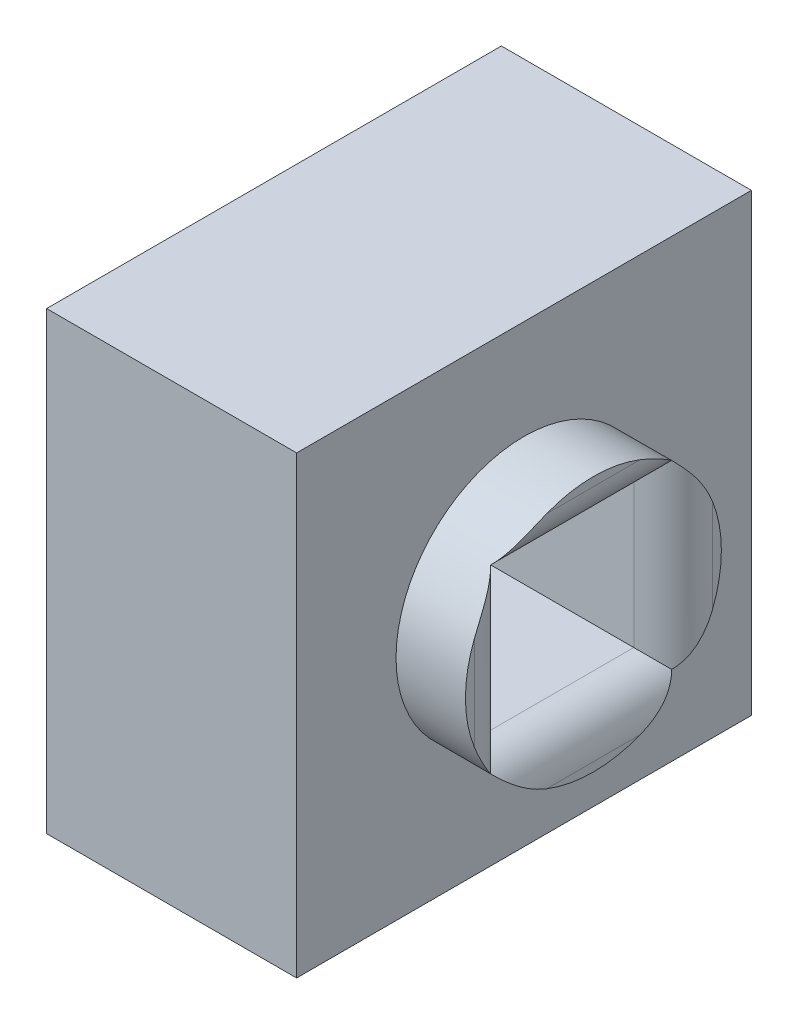
ISO-10303-21;
HEADER;
FILE_DESCRIPTION(('STEP AP214'),'2;1');
FILE_NAME('part.step','',(''),(''),'','','');
FILE_SCHEMA(('AUTOMOTIVE_DESIGN { 1 0 10303 214 1 1 1 1 }'));
ENDSEC;
DATA;
#1=APPLICATION_CONTEXT('core data for automotive mechanical design processes');
#2=APPLICATION_PROTOCOL_DEFINITION('international standard','automotive_design',2000,#1);
#3=PRODUCT_CONTEXT('',#1,'mechanical');
#4=PRODUCT('Part','Part','',(#3));
#5=PRODUCT_RELATED_PRODUCT_CATEGORY('part','',(#4));
#6=PRODUCT_DEFINITION_FORMATION('','',#4);
#7=PRODUCT_DEFINITION_CONTEXT('part definition',#1,'design');
#8=PRODUCT_DEFINITION('design','',#6,#7);
#9=PRODUCT_DEFINITION_SHAPE('','',#8);
#10=(LENGTH_UNIT() NAMED_UNIT(*) SI_UNIT(.MILLI.,.METRE.));
#11=(NAMED_UNIT(*) PLANE_ANGLE_UNIT() SI_UNIT($,.RADIAN.));
#12=(NAMED_UNIT(*) SI_UNIT($,.STERADIAN.) SOLID_ANGLE_UNIT());
#13=UNCERTAINTY_MEASURE_WITH_UNIT(LENGTH_MEASURE(1.E-05),#10,'distance_accuracy_value','');
#14=(GEOMETRIC_REPRESENTATION_CONTEXT(3) GLOBAL_UNCERTAINTY_ASSIGNED_CONTEXT((#13)) GLOBAL_UNIT_ASSIGNED_CONTEXT((#10,
#11,#12)) REPRESENTATION_CONTEXT('',''));
#15=CARTESIAN_POINT('',(0.,0.,0.));
#16=DIRECTION('',(0.,0.,1.));
#17=DIRECTION('',(1.,0.,0.));
#18=AXIS2_PLACEMENT_3D('',#15,#16,#17);
#19=CARTESIAN_POINT('',(16.225,4.05,-4.05));
#20=DIRECTION('',(1.,0.,0.));
#21=DIRECTION('',(0.,0.,-1.));
#22=AXIS2_PLACEMENT_3D('',#19,#20,#21);
#23=PLANE('',#22);
#24=CARTESIAN_POINT('',(16.225,4.05,-4.05));
#25=DIRECTION('',(1.,0.,0.));
#26=DIRECTION('',(0.,0.,-1.));
#27=AXIS2_PLACEMENT_3D('',#24,#25,#26);
#28=CIRCLE('',#27,6.5);
#29=CARTESIAN_POINT('',(16.225,6.42644692766322,2.));
#30=VERTEX_POINT('',#29);
#31=CARTESIAN_POINT('',(16.225,1.67355307233677,2.));
#32=VERTEX_POINT('',#31);
#33=EDGE_CURVE('E466',#30,#32,#28,.T.);
#34=ORIENTED_EDGE('',*,*,#33,.T.);
#35=DIRECTION('',(0.,-1.,0.));
#36=VECTOR('',#35,1.);
#37=CARTESIAN_POINT('',(16.225,4.05,2.));
#38=LINE('',#37,#36);
#39=EDGE_CURVE('E12',#32,#30,#38,.F.);
#40=ORIENTED_EDGE('',*,*,#39,.T.);
#41=EDGE_LOOP('',(#34,#40));
#42=FACE_BOUND('',#41,.T.);
#43=ADVANCED_FACE('F58',(#42),#23,.T.);
#44=CARTESIAN_POINT('',(16.225,-2.,-1.67355307233677));
#45=VERTEX_POINT('',#44);
#46=CARTESIAN_POINT('',(16.225,-2.,-6.42644692766322));
#47=VERTEX_POINT('',#46);
#48=EDGE_CURVE('E381',#45,#47,#28,.T.);
#49=ORIENTED_EDGE('',*,*,#48,.T.);
#50=DIRECTION('',(0.,0.,-1.));
#51=VECTOR('',#50,1.);
#52=CARTESIAN_POINT('',(16.225,-2.,-4.05));
#53=LINE('',#52,#51);
#54=EDGE_CURVE('E68',#47,#45,#53,.F.);
#55=ORIENTED_EDGE('',*,*,#54,.T.);
#56=EDGE_LOOP('',(#49,#55));
#57=FACE_BOUND('',#56,.T.);
#58=ADVANCED_FACE('F361',(#57),#23,.T.);
#59=CARTESIAN_POINT('',(16.225,1.67355307233677,-10.1));
#60=VERTEX_POINT('',#59);
#61=CARTESIAN_POINT('',(16.225,6.42644692766322,-10.1));
#62=VERTEX_POINT('',#61);
#63=EDGE_CURVE('E378',#60,#62,#28,.T.);
#64=ORIENTED_EDGE('',*,*,#63,.T.);
#65=DIRECTION('',(0.,1.,0.));
#66=VECTOR('',#65,1.);
#67=CARTESIAN_POINT('',(16.225,4.05,-10.1));
#68=LINE('',#67,#66);
#69=EDGE_CURVE('E380',#62,#60,#68,.F.);
#70=ORIENTED_EDGE('',*,*,#69,.T.);
#71=EDGE_LOOP('',(#64,#70));
#72=FACE_BOUND('',#71,.T.);
#73=ADVANCED_FACE('F345',(#72),#23,.T.);
#74=CARTESIAN_POINT('',(12.7,0.,0.));
#75=DIRECTION('',(1.,0.,0.));
#76=DIRECTION('',(0.,0.,-1.));
#77=AXIS2_PLACEMENT_3D('',#74,#75,#76);
#78=PLANE('',#77);
#79=DIRECTION('',(0.,-1.,0.));
#80=VECTOR('',#79,1.);
#81=CARTESIAN_POINT('',(12.7,0.,7.5));
#82=LINE('',#81,#80);
#83=CARTESIAN_POINT('',(12.7,15.6,7.5));
#84=VERTEX_POINT('',#83);
#85=CARTESIAN_POINT('',(12.7,-7.5,7.5));
#86=VERTEX_POINT('',#85);
#87=EDGE_CURVE('E186',#84,#86,#82,.T.);
#88=ORIENTED_EDGE('',*,*,#87,.T.);
#89=DIRECTION('',(0.,0.,-1.));
#90=VECTOR('',#89,1.);
#91=CARTESIAN_POINT('',(12.7,-7.5,0.));
#92=LINE('',#91,#90);
#93=CARTESIAN_POINT('',(12.7,-7.5,-15.6));
#94=VERTEX_POINT('',#93);
#95=EDGE_CURVE('E175',#86,#94,#92,.T.);
#96=ORIENTED_EDGE('',*,*,#95,.T.);
#97=DIRECTION('',(0.,1.,0.));
#98=VECTOR('',#97,1.);
#99=CARTESIAN_POINT('',(12.7,0.,-15.6));
#100=LINE('',#99,#98);
#101=CARTESIAN_POINT('',(12.7,15.6,-15.6));
#102=VERTEX_POINT('',#101);
#103=EDGE_CURVE('E185',#94,#102,#100,.T.);
#104=ORIENTED_EDGE('',*,*,#103,.T.);
#105=DIRECTION('',(0.,0.,1.));
#106=VECTOR('',#105,1.);
#107=CARTESIAN_POINT('',(12.7,15.6,0.));
#108=LINE('',#107,#106);
#109=EDGE_CURVE('E192',#102,#84,#108,.T.);
#110=ORIENTED_EDGE('',*,*,#109,.T.);
#111=EDGE_LOOP('',(#88,#96,#104,#110));
#112=FACE_BOUND('',#111,.T.);
#113=CARTESIAN_POINT('',(12.7,4.05,-4.05));
#114=DIRECTION('',(1.,0.,0.));
#115=DIRECTION('',(0.,0.,-1.));
#116=AXIS2_PLACEMENT_3D('',#113,#114,#115);
#117=CIRCLE('',#116,6.5);
#118=CARTESIAN_POINT('',(12.7,4.05,-10.55));
#119=VERTEX_POINT('',#118);
#120=EDGE_CURVE('E382',#119,#119,#117,.T.);
#121=ORIENTED_EDGE('',*,*,#120,.F.);
#122=EDGE_LOOP('',(#121));
#123=FACE_BOUND('',#122,.T.);
#124=ADVANCED_FACE('F189',(#112,#123),#78,.T.);
#125=CARTESIAN_POINT('',(0.,0.,0.));
#126=DIRECTION('',(1.,0.,0.));
#127=DIRECTION('',(0.,0.,-1.));
#128=AXIS2_PLACEMENT_3D('',#125,#126,#127);
#129=PLANE('',#128);
#130=DIRECTION('',(0.,1.,0.));
#131=VECTOR('',#130,1.);
#132=CARTESIAN_POINT('',(0.,8.1,-10.1));
#133=LINE('',#132,#131);
#134=CARTESIAN_POINT('',(0.,-2.,-10.1));
#135=VERTEX_POINT('',#134);
#136=CARTESIAN_POINT('',(0.,10.1,-10.1));
#137=VERTEX_POINT('',#136);
#138=EDGE_CURVE('E201',#135,#137,#133,.T.);
#139=ORIENTED_EDGE('',*,*,#138,.T.);
#140=DIRECTION('',(0.,0.,1.));
#141=VECTOR('',#140,1.);
#142=CARTESIAN_POINT('',(0.,10.1,0.));
#143=LINE('',#142,#141);
#144=CARTESIAN_POINT('',(0.,10.1,2.));
#145=VERTEX_POINT('',#144);
#146=EDGE_CURVE('E212',#137,#145,#143,.T.);
#147=ORIENTED_EDGE('',*,*,#146,.T.);
#148=DIRECTION('',(0.,-1.,0.));
#149=VECTOR('',#148,1.);
#150=CARTESIAN_POINT('',(0.,0.,2.));
#151=LINE('',#150,#149);
#152=CARTESIAN_POINT('',(0.,-2.,2.));
#153=VERTEX_POINT('',#152);
#154=EDGE_CURVE('E210',#145,#153,#151,.T.);
#155=ORIENTED_EDGE('',*,*,#154,.T.);
#156=DIRECTION('',(0.,0.,-1.));
#157=VECTOR('',#156,1.);
#158=CARTESIAN_POINT('',(0.,-2.,-8.1));
#159=LINE('',#158,#157);
#160=EDGE_CURVE('E203',#153,#135,#159,.T.);
#161=ORIENTED_EDGE('',*,*,#160,.T.);
#162=EDGE_LOOP('',(#139,#147,#155,#161));
#163=FACE_BOUND('',#162,.T.);
#164=DIRECTION('',(0.,-1.,0.));
#165=VECTOR('',#164,1.);
#166=CARTESIAN_POINT('',(0.,0.,7.5));
#167=LINE('',#166,#165);
#168=CARTESIAN_POINT('',(0.,15.6,7.5));
#169=VERTEX_POINT('',#168);
#170=CARTESIAN_POINT('',(0.,-7.5,7.5));
#171=VERTEX_POINT('',#170);
#172=EDGE_CURVE('E200',#169,#171,#167,.T.);
#173=ORIENTED_EDGE('',*,*,#172,.F.);
#174=DIRECTION('',(0.,0.,1.));
#175=VECTOR('',#174,1.);
#176=CARTESIAN_POINT('',(0.,15.6,0.));
#177=LINE('',#176,#175);
#178=CARTESIAN_POINT('',(0.,15.6,-15.6));
#179=VERTEX_POINT('',#178);
#180=EDGE_CURVE('E196',#179,#169,#177,.T.);
#181=ORIENTED_EDGE('',*,*,#180,.F.);
#182=DIRECTION('',(0.,1.,0.));
#183=VECTOR('',#182,1.);
#184=CARTESIAN_POINT('',(0.,0.,-15.6));
#185=LINE('',#184,#183);
#186=CARTESIAN_POINT('',(0.,-7.5,-15.6));
#187=VERTEX_POINT('',#186);
#188=EDGE_CURVE('E440',#187,#179,#185,.T.);
#189=ORIENTED_EDGE('',*,*,#188,.F.);
#190=DIRECTION('',(0.,0.,-1.));
#191=VECTOR('',#190,1.);
#192=CARTESIAN_POINT('',(0.,-7.5,0.));
#193=LINE('',#192,#191);
#194=EDGE_CURVE('E438',#171,#187,#193,.T.);
#195=ORIENTED_EDGE('',*,*,#194,.F.);
#196=EDGE_LOOP('',(#173,#181,#189,#195));
#197=FACE_BOUND('',#196,.T.);
#198=ADVANCED_FACE('F328',(#163,#197),#129,.F.);
#199=CARTESIAN_POINT('',(12.7,0.,7.5));
#200=DIRECTION('',(0.,0.,-1.));
#201=DIRECTION('',(-1.,0.,0.));
#202=AXIS2_PLACEMENT_3D('',#199,#200,#201);
#203=PLANE('',#202);
#204=ORIENTED_EDGE('',*,*,#172,.T.);
#205=DIRECTION('',(-1.,0.,0.));
#206=VECTOR('',#205,1.);
#207=CARTESIAN_POINT('',(12.7,-7.5,7.5));
#208=LINE('',#207,#206);
#209=EDGE_CURVE('E179',#86,#171,#208,.T.);
#210=ORIENTED_EDGE('',*,*,#209,.F.);
#211=ORIENTED_EDGE('',*,*,#87,.F.);
#212=DIRECTION('',(-1.,0.,0.));
#213=VECTOR('',#212,1.);
#214=CARTESIAN_POINT('',(12.7,15.6,7.5));
#215=LINE('',#214,#213);
#216=EDGE_CURVE('E436',#84,#169,#215,.T.);
#217=ORIENTED_EDGE('',*,*,#216,.T.);
#218=EDGE_LOOP('',(#204,#210,#211,#217));
#219=FACE_BOUND('',#218,.T.);
#220=ADVANCED_FACE('F198',(#219),#203,.F.);
#221=CARTESIAN_POINT('',(12.7,-7.5,0.));
#222=DIRECTION('',(0.,1.,0.));
#223=DIRECTION('',(0.,0.,1.));
#224=AXIS2_PLACEMENT_3D('',#221,#222,#223);
#225=PLANE('',#224);
#226=ORIENTED_EDGE('',*,*,#194,.T.);
#227=DIRECTION('',(-1.,0.,0.));
#228=VECTOR('',#227,1.);
#229=CARTESIAN_POINT('',(12.7,-7.5,-15.6));
#230=LINE('',#229,#228);
#231=EDGE_CURVE('E182',#94,#187,#230,.T.);
#232=ORIENTED_EDGE('',*,*,#231,.F.);
#233=ORIENTED_EDGE('',*,*,#95,.F.);
#234=ORIENTED_EDGE('',*,*,#209,.T.);
#235=EDGE_LOOP('',(#226,#232,#233,#234));
#236=FACE_BOUND('',#235,.T.);
#237=ADVANCED_FACE('F177',(#236),#225,.F.);
#238=CARTESIAN_POINT('',(12.7,0.,-15.6));
#239=DIRECTION('',(0.,0.,1.));
#240=DIRECTION('',(1.,0.,0.));
#241=AXIS2_PLACEMENT_3D('',#238,#239,#240);
#242=PLANE('',#241);
#243=ORIENTED_EDGE('',*,*,#188,.T.);
#244=DIRECTION('',(-1.,0.,0.));
#245=VECTOR('',#244,1.);
#246=CARTESIAN_POINT('',(12.7,15.6,-15.6));
#247=LINE('',#246,#245);
#248=EDGE_CURVE('E205',#102,#179,#247,.T.);
#249=ORIENTED_EDGE('',*,*,#248,.F.);
#250=ORIENTED_EDGE('',*,*,#103,.F.);
#251=ORIENTED_EDGE('',*,*,#231,.T.);
#252=EDGE_LOOP('',(#243,#249,#250,#251));
#253=FACE_BOUND('',#252,.T.);
#254=ADVANCED_FACE('F331',(#253),#242,.F.);
#255=CARTESIAN_POINT('',(12.7,15.6,0.));
#256=DIRECTION('',(0.,-1.,0.));
#257=DIRECTION('',(0.,0.,-1.));
#258=AXIS2_PLACEMENT_3D('',#255,#256,#257);
#259=PLANE('',#258);
#260=ORIENTED_EDGE('',*,*,#180,.T.);
#261=ORIENTED_EDGE('',*,*,#216,.F.);
#262=ORIENTED_EDGE('',*,*,#109,.F.);
#263=ORIENTED_EDGE('',*,*,#248,.T.);
#264=EDGE_LOOP('',(#260,#261,#262,#263));
#265=FACE_BOUND('',#264,.T.);
#266=ADVANCED_FACE('F334',(#265),#259,.F.);
#267=CARTESIAN_POINT('',(12.7,0.,0.));
#268=DIRECTION('',(0.,0.,-1.));
#269=DIRECTION('',(-1.,0.,0.));
#270=AXIS2_PLACEMENT_3D('',#267,#268,#269);
#271=PLANE('',#270);
#272=DIRECTION('',(-1.,0.,0.));
#273=VECTOR('',#272,1.);
#274=CARTESIAN_POINT('',(12.7,0.,0.));
#275=LINE('',#274,#273);
#276=CARTESIAN_POINT('',(14.225,0.,0.));
#277=VERTEX_POINT('',#276);
#278=CARTESIAN_POINT('',(2.,0.,0.));
#279=VERTEX_POINT('',#278);
#280=EDGE_CURVE('E427',#277,#279,#275,.T.);
#281=ORIENTED_EDGE('',*,*,#280,.T.);
#282=DIRECTION('',(0.,-1.,0.));
#283=VECTOR('',#282,1.);
#284=CARTESIAN_POINT('',(2.,8.1,0.));
#285=LINE('',#284,#283);
#286=CARTESIAN_POINT('',(2.,8.1,0.));
#287=VERTEX_POINT('',#286);
#288=EDGE_CURVE('E223',#279,#287,#285,.F.);
#289=ORIENTED_EDGE('',*,*,#288,.T.);
#290=DIRECTION('',(-1.,0.,0.));
#291=VECTOR('',#290,1.);
#292=CARTESIAN_POINT('',(12.7,8.1,0.));
#293=LINE('',#292,#291);
#294=CARTESIAN_POINT('',(14.225,8.1,0.));
#295=VERTEX_POINT('',#294);
#296=EDGE_CURVE('E425',#295,#287,#293,.T.);
#297=ORIENTED_EDGE('',*,*,#296,.F.);
#298=DIRECTION('',(0.,-1.,0.));
#299=VECTOR('',#298,1.);
#300=CARTESIAN_POINT('',(14.225,0.,0.));
#301=LINE('',#300,#299);
#302=EDGE_CURVE('E220',#295,#277,#301,.T.);
#303=ORIENTED_EDGE('',*,*,#302,.T.);
#304=EDGE_LOOP('',(#281,#289,#297,#303));
#305=FACE_BOUND('',#304,.T.);
#306=ADVANCED_FACE('F338',(#305),#271,.T.);
#307=CARTESIAN_POINT('',(12.7,0.,0.));
#308=DIRECTION('',(0.,1.,0.));
#309=DIRECTION('',(0.,0.,1.));
#310=AXIS2_PLACEMENT_3D('',#307,#308,#309);
#311=PLANE('',#310);
#312=DIRECTION('',(-1.,0.,0.));
#313=VECTOR('',#312,1.);
#314=CARTESIAN_POINT('',(12.7,0.,-8.1));
#315=LINE('',#314,#313);
#316=CARTESIAN_POINT('',(14.225,0.,-8.1));
#317=VERTEX_POINT('',#316);
#318=CARTESIAN_POINT('',(2.,0.,-8.1));
#319=VERTEX_POINT('',#318);
#320=EDGE_CURVE('E421',#317,#319,#315,.T.);
#321=ORIENTED_EDGE('',*,*,#320,.T.);
#322=DIRECTION('',(0.,0.,-1.));
#323=VECTOR('',#322,1.);
#324=CARTESIAN_POINT('',(2.,0.,0.));
#325=LINE('',#324,#323);
#326=EDGE_CURVE('E227',#319,#279,#325,.F.);
#327=ORIENTED_EDGE('',*,*,#326,.T.);
#328=ORIENTED_EDGE('',*,*,#280,.F.);
#329=DIRECTION('',(0.,0.,-1.));
#330=VECTOR('',#329,1.);
#331=CARTESIAN_POINT('',(14.225,0.,0.));
#332=LINE('',#331,#330);
#333=EDGE_CURVE('E225',#277,#317,#332,.T.);
#334=ORIENTED_EDGE('',*,*,#333,.T.);
#335=EDGE_LOOP('',(#321,#327,#328,#334));
#336=FACE_BOUND('',#335,.T.);
#337=ADVANCED_FACE('F348',(#336),#311,.T.);
#338=CARTESIAN_POINT('',(12.7,0.,-8.1));
#339=DIRECTION('',(0.,0.,1.));
#340=DIRECTION('',(1.,0.,0.));
#341=AXIS2_PLACEMENT_3D('',#338,#339,#340);
#342=PLANE('',#341);
#343=DIRECTION('',(-1.,0.,0.));
#344=VECTOR('',#343,1.);
#345=CARTESIAN_POINT('',(12.7,8.1,-8.1));
#346=LINE('',#345,#344);
#347=CARTESIAN_POINT('',(14.225,8.1,-8.1));
#348=VERTEX_POINT('',#347);
#349=CARTESIAN_POINT('',(2.,8.1,-8.1));
#350=VERTEX_POINT('',#349);
#351=EDGE_CURVE('E419',#348,#350,#346,.T.);
#352=ORIENTED_EDGE('',*,*,#351,.T.);
#353=DIRECTION('',(0.,1.,0.));
#354=VECTOR('',#353,1.);
#355=CARTESIAN_POINT('',(2.,0.,-8.1));
#356=LINE('',#355,#354);
#357=EDGE_CURVE('E231',#350,#319,#356,.F.);
#358=ORIENTED_EDGE('',*,*,#357,.T.);
#359=ORIENTED_EDGE('',*,*,#320,.F.);
#360=DIRECTION('',(0.,1.,0.));
#361=VECTOR('',#360,1.);
#362=CARTESIAN_POINT('',(14.225,0.,-8.1));
#363=LINE('',#362,#361);
#364=EDGE_CURVE('E229',#317,#348,#363,.T.);
#365=ORIENTED_EDGE('',*,*,#364,.T.);
#366=EDGE_LOOP('',(#352,#358,#359,#365));
#367=FACE_BOUND('',#366,.T.);
#368=ADVANCED_FACE('F351',(#367),#342,.T.);
#369=CARTESIAN_POINT('',(12.7,8.1,0.));
#370=DIRECTION('',(0.,-1.,0.));
#371=DIRECTION('',(0.,0.,-1.));
#372=AXIS2_PLACEMENT_3D('',#369,#370,#371);
#373=PLANE('',#372);
#374=ORIENTED_EDGE('',*,*,#296,.T.);
#375=DIRECTION('',(0.,0.,1.));
#376=VECTOR('',#375,1.);
#377=CARTESIAN_POINT('',(2.,8.1,-8.1));
#378=LINE('',#377,#376);
#379=EDGE_CURVE('E217',#287,#350,#378,.F.);
#380=ORIENTED_EDGE('',*,*,#379,.T.);
#381=ORIENTED_EDGE('',*,*,#351,.F.);
#382=DIRECTION('',(0.,0.,1.));
#383=VECTOR('',#382,1.);
#384=CARTESIAN_POINT('',(14.225,8.1,0.));
#385=LINE('',#384,#383);
#386=EDGE_CURVE('E215',#348,#295,#385,.T.);
#387=ORIENTED_EDGE('',*,*,#386,.T.);
#388=EDGE_LOOP('',(#374,#380,#381,#387));
#389=FACE_BOUND('',#388,.T.);
#390=ADVANCED_FACE('F256',(#389),#373,.T.);
#391=CARTESIAN_POINT('',(16.225,10.1,-6.42644692766322));
#392=VERTEX_POINT('',#391);
#393=CARTESIAN_POINT('',(16.225,10.1,-1.67355307233677));
#394=VERTEX_POINT('',#393);
#395=EDGE_CURVE('E384',#392,#394,#28,.T.);
#396=ORIENTED_EDGE('',*,*,#395,.T.);
#397=DIRECTION('',(0.,0.,1.));
#398=VECTOR('',#397,1.);
#399=CARTESIAN_POINT('',(16.225,10.1,-4.05));
#400=LINE('',#399,#398);
#401=EDGE_CURVE('E389',#394,#392,#400,.F.);
#402=ORIENTED_EDGE('',*,*,#401,.T.);
#403=EDGE_LOOP('',(#396,#402));
#404=FACE_BOUND('',#403,.T.);
#405=ADVANCED_FACE('F255',(#404),#23,.T.);
#406=CARTESIAN_POINT('',(16.225,4.05,-4.05));
#407=DIRECTION('',(-1.,0.,0.));
#408=DIRECTION('',(0.,0.,1.));
#409=AXIS2_PLACEMENT_3D('',#406,#407,#408);
#410=CYLINDRICAL_SURFACE('',#409,6.5);
#411=CARTESIAN_POINT('',(16.225,-2.,-1.67355307233677));
#412=CARTESIAN_POINT('',(16.2249959811202,-1.97235378390795,-1.6031715161774));
#413=CARTESIAN_POINT('',(16.2244271420203,-1.9434817636797,-1.53327853735045));
#414=CARTESIAN_POINT('',(16.2218213053706,-1.88331791909283,-1.3945411360512));
#415=CARTESIAN_POINT('',(16.2197837812313,-1.85202523040955,-1.32569709871442));
#416=CARTESIAN_POINT('',(16.2109325814054,-1.75428704749068,-1.12027361140974));
#417=CARTESIAN_POINT('',(16.2013738133196,-1.68424437904025,-0.98547230135494));
#418=CARTESIAN_POINT('',(16.1724782765073,-1.53896880484818,-0.728222489891016));
#419=CARTESIAN_POINT('',(16.1536290499378,-1.46414215526886,-0.605491442732811));
#420=CARTESIAN_POINT('',(16.1032272916027,-1.30791450894618,-0.367210032932802));
#421=CARTESIAN_POINT('',(16.0717021877211,-1.22652800838858,-0.251644784236254));
#422=CARTESIAN_POINT('',(16.0092019770719,-1.0947587133765,-0.0765991394390406));
#423=CARTESIAN_POINT('',(15.9836373400817,-1.04582718112609,-0.0140765969337308));
#424=CARTESIAN_POINT('',(15.9264212177193,-0.947186326034534,0.107432341359657));
#425=CARTESIAN_POINT('',(15.8947736952187,-0.897477528828584,0.166421006754207));
#426=CARTESIAN_POINT('',(15.8237624734857,-0.796731093266903,0.281881764072501));
#427=CARTESIAN_POINT('',(15.7842116131057,-0.745694247263902,0.338241097776519));
#428=CARTESIAN_POINT('',(15.6973221776111,-0.644745846508904,0.44610172711604));
#429=CARTESIAN_POINT('',(15.6499615516376,-0.594837946586101,0.497588598209287));
#430=CARTESIAN_POINT('',(15.5984803749322,-0.546194077712442,0.546194077712727));
#431=B_SPLINE_CURVE_WITH_KNOTS('',3,(#411,#412,#413,#414,#415,#416,#417,#418,#419,#420,#421,
#422,#423,#424,#425,#426,#427,#428,#429,#430),.UNSPECIFIED.,.F.,.F.,(4,2,2,2,2,2,2,2,2,4),(0.,
0.226819843401165,0.453721052351342,0.909675057096129,1.34390639282249,1.77720315815111,
2.02717619324679,2.27698692480715,2.53362149887988,2.7909934931223),.UNSPECIFIED.);
#432=CARTESIAN_POINT('',(15.5984803749322,-0.546194077712442,0.546194077712727));
#433=VERTEX_POINT('',#432);
#434=EDGE_CURVE('E76',#45,#433,#431,.T.);
#435=ORIENTED_EDGE('',*,*,#434,.T.);
#436=CARTESIAN_POINT('',(15.5984803749315,-0.546194077712558,0.546194077712558));
#437=CARTESIAN_POINT('',(15.6503943632174,-0.497180637525401,0.595247390109846));
#438=CARTESIAN_POINT('',(15.6981171475478,-0.445237532343599,0.645584191615423));
#439=CARTESIAN_POINT('',(15.7855970575146,-0.336396436551203,0.747391038054948));
#440=CARTESIAN_POINT('',(15.8253779108179,-0.27951395662668,0.798857181528751));
#441=CARTESIAN_POINT('',(15.8971697763163,-0.162256509424775,0.901048824450199));
#442=CARTESIAN_POINT('',(15.9292859792956,-0.101944837622282,0.951774140090624));
#443=CARTESIAN_POINT('',(15.987220072445,0.0223519024784992,1.05239625713191));
#444=CARTESIAN_POINT('',(16.0130325754724,0.0863400554187585,1.10229231615295));
#445=CARTESIAN_POINT('',(16.0659017471144,0.236894465040143,1.21512127913151));
#446=CARTESIAN_POINT('',(16.0910524211534,0.324523602337731,1.27752647444472));
#447=CARTESIAN_POINT('',(16.1335426900789,0.504067046183623,1.3986790752737));
#448=CARTESIAN_POINT('',(16.1508805688172,0.595982289324187,1.45742567470734));
#449=CARTESIAN_POINT('',(16.1793060962456,0.783870812251773,1.57089971844947));
#450=CARTESIAN_POINT('',(16.1903588869482,0.879863610577092,1.62560331128217));
#451=CARTESIAN_POINT('',(16.2074245222647,1.07482363050647,1.73018697549353));
#452=CARTESIAN_POINT('',(16.213438838884,1.17378997462149,1.78006845189794));
#453=CARTESIAN_POINT('',(16.2202291117407,1.339774364581,1.85846582428838));
#454=CARTESIAN_POINT('',(16.2220952818198,1.40607370556139,1.88842955197089));
#455=CARTESIAN_POINT('',(16.2244750175129,1.53928947559456,1.94596274132279));
#456=CARTESIAN_POINT('',(16.2249960677301,1.60620040188746,1.97354462257235));
#457=CARTESIAN_POINT('',(16.225,1.67355307233677,2.));
#458=B_SPLINE_CURVE_WITH_KNOTS('',3,(#436,#437,#438,#439,#440,#441,#442,#443,#444,#445,#446,
#447,#448,#449,#450,#451,#452,#453,#454,#455,#456,#457),.UNSPECIFIED.,.F.,.F.,(4,2,2,2,2,2,2,2,
2,2,4),(0.,0.259528583268805,0.51826978541326,0.773224327649188,1.02839599752028,
1.35932859391584,1.69033384712926,2.0231574323131,2.35588374814841,2.57417395929249,
2.79124690174028),.UNSPECIFIED.);
#459=EDGE_CURVE('E294',#433,#32,#458,.T.);
#460=ORIENTED_EDGE('',*,*,#459,.T.);
#461=ORIENTED_EDGE('',*,*,#33,.F.);
#462=CARTESIAN_POINT('',(16.225,6.42644692766322,2.));
#463=CARTESIAN_POINT('',(16.2249959811202,6.4968284838226,1.97235378390795));
#464=CARTESIAN_POINT('',(16.2244271420203,6.56672146264955,1.9434817636797));
#465=CARTESIAN_POINT('',(16.2218213053706,6.7054588639488,1.88331791909283));
#466=CARTESIAN_POINT('',(16.2197837812313,6.77430290128558,1.85202523040955));
#467=CARTESIAN_POINT('',(16.2109325814054,6.97972638859026,1.75428704749068));
#468=CARTESIAN_POINT('',(16.2013738133196,7.11452769864506,1.68424437904025));
#469=CARTESIAN_POINT('',(16.1724782765073,7.37177751010898,1.53896880484818));
#470=CARTESIAN_POINT('',(16.1536290499378,7.49450855726719,1.46414215526886));
#471=CARTESIAN_POINT('',(16.1032272916027,7.7327899670672,1.30791450894618));
#472=CARTESIAN_POINT('',(16.0717021877211,7.84835521576375,1.22652800838858));
#473=CARTESIAN_POINT('',(16.0092019770719,8.02340086056096,1.0947587133765));
#474=CARTESIAN_POINT('',(15.9836373400817,8.08592340306627,1.04582718112609));
#475=CARTESIAN_POINT('',(15.9264212177193,8.20743234135966,0.947186326034534));
#476=CARTESIAN_POINT('',(15.8947736952187,8.26642100675421,0.897477528828583));
#477=CARTESIAN_POINT('',(15.8237624734857,8.3818817640725,0.796731093266902));
#478=CARTESIAN_POINT('',(15.7842116131057,8.43824109777652,0.745694247263902));
#479=CARTESIAN_POINT('',(15.6973221776111,8.54610172711604,0.644745846508904));
#480=CARTESIAN_POINT('',(15.6499615516376,8.59758859820929,0.594837946586101));
#481=CARTESIAN_POINT('',(15.5984803749322,8.64619407771273,0.546194077712441));
#482=B_SPLINE_CURVE_WITH_KNOTS('',3,(#462,#463,#464,#465,#466,#467,#468,#469,#470,#471,#472,
#473,#474,#475,#476,#477,#478,#479,#480,#481),.UNSPECIFIED.,.F.,.F.,(4,2,2,2,2,2,2,2,2,4),(0.,
0.226819843401165,0.453721052351343,0.90967505709613,1.34390639282249,1.77720315815111,
2.02717619324679,2.27698692480715,2.53362149887988,2.79099349312231),.UNSPECIFIED.);
#483=CARTESIAN_POINT('',(15.5984803749315,8.64619407771256,0.546194077712558));
#484=VERTEX_POINT('',#483);
#485=EDGE_CURVE('E271',#30,#484,#482,.T.);
#486=ORIENTED_EDGE('',*,*,#485,.T.);
#487=CARTESIAN_POINT('',(15.5984803749315,8.64619407771256,0.546194077712558));
#488=CARTESIAN_POINT('',(15.6503943632174,8.69524739010985,0.4971806375254));
#489=CARTESIAN_POINT('',(15.6981171475478,8.74558419161542,0.445237532343597));
#490=CARTESIAN_POINT('',(15.7855970575146,8.84739103805495,0.336396436551201));
#491=CARTESIAN_POINT('',(15.8253779108179,8.89885718152875,0.279513956626679));
#492=CARTESIAN_POINT('',(15.8971697763163,9.0010488244502,0.162256509424774));
#493=CARTESIAN_POINT('',(15.9292859792956,9.05177414009062,0.101944837622282));
#494=CARTESIAN_POINT('',(15.987220072445,9.15239625713191,-0.0223519024784991));
#495=CARTESIAN_POINT('',(16.0130325754724,9.20229231615295,-0.0863400554187584));
#496=CARTESIAN_POINT('',(16.0659017471144,9.31512127913151,-0.236894465040143));
#497=CARTESIAN_POINT('',(16.0910524211534,9.37752647444472,-0.32452360233773));
#498=CARTESIAN_POINT('',(16.1335426900789,9.4986790752737,-0.504067046183622));
#499=CARTESIAN_POINT('',(16.1508805688173,9.55742567470734,-0.595982289324186));
#500=CARTESIAN_POINT('',(16.1793060962456,9.67089971844947,-0.783870812251772));
#501=CARTESIAN_POINT('',(16.1903588869482,9.72560331128217,-0.879863610577091));
#502=CARTESIAN_POINT('',(16.2074245222647,9.83018697549353,-1.07482363050646));
#503=CARTESIAN_POINT('',(16.213438838884,9.88006845189794,-1.17378997462149));
#504=CARTESIAN_POINT('',(16.2202291117407,9.95846582428837,-1.339774364581));
#505=CARTESIAN_POINT('',(16.2220952818198,9.98842955197089,-1.40607370556139));
#506=CARTESIAN_POINT('',(16.2244750175129,10.0459627413228,-1.53928947559456));
#507=CARTESIAN_POINT('',(16.2249960677301,10.0735446225723,-1.60620040188746));
#508=CARTESIAN_POINT('',(16.225,10.1,-1.67355307233677));
#509=B_SPLINE_CURVE_WITH_KNOTS('',3,(#487,#488,#489,#490,#491,#492,#493,#494,#495,#496,#497,
#498,#499,#500,#501,#502,#503,#504,#505,#506,#507,#508),.UNSPECIFIED.,.F.,.F.,(4,2,2,2,2,2,2,2,
2,2,4),(0.,0.259528583268806,0.51826978541326,0.773224327649189,1.02839599752028,
1.35932859391584,1.69033384712926,2.0231574323131,2.35588374814841,2.57417395929248,
2.79124690174028),.UNSPECIFIED.);
#510=EDGE_CURVE('E264',#484,#394,#509,.T.);
#511=ORIENTED_EDGE('',*,*,#510,.T.);
#512=ORIENTED_EDGE('',*,*,#395,.F.);
#513=CARTESIAN_POINT('',(16.225,10.1,-6.42644692766322));
#514=CARTESIAN_POINT('',(16.2249959811202,10.0723537839079,-6.4968284838226));
#515=CARTESIAN_POINT('',(16.2244271420203,10.0434817636797,-6.56672146264955));
#516=CARTESIAN_POINT('',(16.2218213053706,9.98331791909283,-6.7054588639488));
#517=CARTESIAN_POINT('',(16.2197837812313,9.95202523040955,-6.77430290128558));
#518=CARTESIAN_POINT('',(16.2109325814054,9.85428704749068,-6.97972638859026));
#519=CARTESIAN_POINT('',(16.2013738133196,9.78424437904025,-7.11452769864506));
#520=CARTESIAN_POINT('',(16.1724782765073,9.63896880484818,-7.37177751010899));
#521=CARTESIAN_POINT('',(16.1536290499378,9.56414215526886,-7.49450855726719));
#522=CARTESIAN_POINT('',(16.1032272916027,9.40791450894618,-7.7327899670672));
#523=CARTESIAN_POINT('',(16.0717021877211,9.32652800838858,-7.84835521576375));
#524=CARTESIAN_POINT('',(16.0092019770719,9.1947587133765,-8.02340086056096));
#525=CARTESIAN_POINT('',(15.9836373400817,9.14582718112608,-8.08592340306627));
#526=CARTESIAN_POINT('',(15.9264212177193,9.04718632603453,-8.20743234135966));
#527=CARTESIAN_POINT('',(15.8947736952187,8.99747752882858,-8.26642100675421));
#528=CARTESIAN_POINT('',(15.8237624734857,8.8967310932669,-8.3818817640725));
#529=CARTESIAN_POINT('',(15.7842116131057,8.8456942472639,-8.43824109777652));
#530=CARTESIAN_POINT('',(15.6973221776111,8.7447458465089,-8.54610172711604));
#531=CARTESIAN_POINT('',(15.6499615516376,8.6948379465861,-8.59758859820929));
#532=CARTESIAN_POINT('',(15.5984803749322,8.64619407771244,-8.64619407771273));
#533=B_SPLINE_CURVE_WITH_KNOTS('',3,(#513,#514,#515,#516,#517,#518,#519,#520,#521,#522,#523,
#524,#525,#526,#527,#528,#529,#530,#531,#532),.UNSPECIFIED.,.F.,.F.,(4,2,2,2,2,2,2,2,2,4),(0.,
0.226819843401165,0.453721052351343,0.90967505709613,1.34390639282249,1.77720315815111,
2.02717619324679,2.27698692480715,2.53362149887988,2.7909934931223),.UNSPECIFIED.);
#534=CARTESIAN_POINT('',(15.5984803749322,8.64619407771244,-8.64619407771273));
#535=VERTEX_POINT('',#534);
#536=EDGE_CURVE('E233',#392,#535,#533,.T.);
#537=ORIENTED_EDGE('',*,*,#536,.T.);
#538=CARTESIAN_POINT('',(15.5984803749315,8.64619407771256,-8.64619407771256));
#539=CARTESIAN_POINT('',(15.6503943632174,8.5971806375254,-8.69524739010985));
#540=CARTESIAN_POINT('',(15.6981171475478,8.5452375323436,-8.74558419161542));
#541=CARTESIAN_POINT('',(15.7855970575146,8.4363964365512,-8.84739103805495));
#542=CARTESIAN_POINT('',(15.8253779108179,8.37951395662668,-8.89885718152875));
#543=CARTESIAN_POINT('',(15.8971697763163,8.26225650942477,-9.0010488244502));
#544=CARTESIAN_POINT('',(15.9292859792956,8.20194483762228,-9.05177414009063));
#545=CARTESIAN_POINT('',(15.987220072445,8.0776480975215,-9.15239625713191));
#546=CARTESIAN_POINT('',(16.0130325754724,8.01365994458124,-9.20229231615295));
#547=CARTESIAN_POINT('',(16.0659017471144,7.86310553495985,-9.31512127913151));
#548=CARTESIAN_POINT('',(16.0910524211534,7.77547639766227,-9.37752647444472));
#549=CARTESIAN_POINT('',(16.1335426900789,7.59593295381638,-9.4986790752737));
#550=CARTESIAN_POINT('',(16.1508805688172,7.50401771067581,-9.55742567470734));
#551=CARTESIAN_POINT('',(16.1793060962456,7.31612918774823,-9.67089971844947));
#552=CARTESIAN_POINT('',(16.1903588869482,7.22013638942291,-9.72560331128217));
#553=CARTESIAN_POINT('',(16.2074245222647,7.02517636949354,-9.83018697549354));
#554=CARTESIAN_POINT('',(16.213438838884,6.92621002537851,-9.88006845189794));
#555=CARTESIAN_POINT('',(16.2202291117407,6.760225635419,-9.95846582428838));
#556=CARTESIAN_POINT('',(16.2220952818198,6.69392629443861,-9.98842955197089));
#557=CARTESIAN_POINT('',(16.2244750175129,6.56071052440544,-10.0459627413228));
#558=CARTESIAN_POINT('',(16.2249960677301,6.49379959811254,-10.0735446225723));
#559=CARTESIAN_POINT('',(16.225,6.42644692766322,-10.1));
#560=B_SPLINE_CURVE_WITH_KNOTS('',3,(#538,#539,#540,#541,#542,#543,#544,#545,#546,#547,#548,
#549,#550,#551,#552,#553,#554,#555,#556,#557,#558,#559),.UNSPECIFIED.,.F.,.F.,(4,2,2,2,2,2,2,2,
2,2,4),(0.,0.259528583268808,0.518269785413261,0.773224327649188,1.02839599752028,
1.35932859391584,1.69033384712926,2.0231574323131,2.35588374814841,2.57417395929248,
2.79124690174028),.UNSPECIFIED.);
#561=EDGE_CURVE('E240',#535,#62,#560,.T.);
#562=ORIENTED_EDGE('',*,*,#561,.T.);
#563=ORIENTED_EDGE('',*,*,#63,.F.);
#564=CARTESIAN_POINT('',(16.225,1.67355307233677,-10.1));
#565=CARTESIAN_POINT('',(16.2249959811202,1.6031715161774,-10.0723537839079));
#566=CARTESIAN_POINT('',(16.2244271420203,1.53327853735045,-10.0434817636797));
#567=CARTESIAN_POINT('',(16.2218213053706,1.3945411360512,-9.98331791909283));
#568=CARTESIAN_POINT('',(16.2197837812313,1.32569709871442,-9.95202523040955));
#569=CARTESIAN_POINT('',(16.2109325814054,1.12027361140974,-9.85428704749068));
#570=CARTESIAN_POINT('',(16.2013738133196,0.98547230135494,-9.78424437904025));
#571=CARTESIAN_POINT('',(16.1724782765073,0.728222489891015,-9.63896880484818));
#572=CARTESIAN_POINT('',(16.1536290499378,0.605491442732809,-9.56414215526886));
#573=CARTESIAN_POINT('',(16.1032272916027,0.3672100329328,-9.40791450894618));
#574=CARTESIAN_POINT('',(16.0717021877211,0.251644784236253,-9.32652800838858));
#575=CARTESIAN_POINT('',(16.0092019770719,0.0765991394390391,-9.1947587133765));
#576=CARTESIAN_POINT('',(15.9836373400817,0.0140765969337297,-9.14582718112608));
#577=CARTESIAN_POINT('',(15.9264212177193,-0.107432341359658,-9.04718632603453));
#578=CARTESIAN_POINT('',(15.8947736952187,-0.166421006754208,-8.99747752882858));
#579=CARTESIAN_POINT('',(15.8237624734857,-0.281881764072501,-8.8967310932669));
#580=CARTESIAN_POINT('',(15.7842116131057,-0.338241097776519,-8.8456942472639));
#581=CARTESIAN_POINT('',(15.6973221776111,-0.44610172711604,-8.7447458465089));
#582=CARTESIAN_POINT('',(15.6499615516376,-0.497588598209286,-8.6948379465861));
#583=CARTESIAN_POINT('',(15.5984803749322,-0.546194077712727,-8.64619407771244));
#584=B_SPLINE_CURVE_WITH_KNOTS('',3,(#564,#565,#566,#567,#568,#569,#570,#571,#572,#573,#574,
#575,#576,#577,#578,#579,#580,#581,#582,#583),.UNSPECIFIED.,.F.,.F.,(4,2,2,2,2,2,2,2,2,4),(0.,
0.226819843401165,0.453721052351343,0.90967505709613,1.34390639282249,1.77720315815111,
2.02717619324679,2.27698692480715,2.53362149887988,2.7909934931223),.UNSPECIFIED.);
#585=CARTESIAN_POINT('',(15.5984803749322,-0.546194077712727,-8.64619407771244));
#586=VERTEX_POINT('',#585);
#587=EDGE_CURVE('E83',#60,#586,#584,.T.);
#588=ORIENTED_EDGE('',*,*,#587,.T.);
#589=CARTESIAN_POINT('',(15.5984803749315,-0.546194077712558,-8.64619407771256));
#590=CARTESIAN_POINT('',(15.6503943632174,-0.595247390109846,-8.5971806375254));
#591=CARTESIAN_POINT('',(15.6981171475478,-0.645584191615424,-8.5452375323436));
#592=CARTESIAN_POINT('',(15.7855970575146,-0.747391038054948,-8.4363964365512));
#593=CARTESIAN_POINT('',(15.8253779108179,-0.798857181528751,-8.37951395662668));
#594=CARTESIAN_POINT('',(15.8971697763163,-0.901048824450199,-8.26225650942477));
#595=CARTESIAN_POINT('',(15.9292859792956,-0.951774140090624,-8.20194483762228));
#596=CARTESIAN_POINT('',(15.987220072445,-1.05239625713191,-8.0776480975215));
#597=CARTESIAN_POINT('',(16.0130325754724,-1.10229231615295,-8.01365994458124));
#598=CARTESIAN_POINT('',(16.0659017471144,-1.21512127913151,-7.86310553495985));
#599=CARTESIAN_POINT('',(16.0910524211534,-1.27752647444472,-7.77547639766227));
#600=CARTESIAN_POINT('',(16.1335426900789,-1.3986790752737,-7.59593295381638));
#601=CARTESIAN_POINT('',(16.1508805688172,-1.45742567470734,-7.50401771067581));
#602=CARTESIAN_POINT('',(16.1793060962456,-1.57089971844947,-7.31612918774823));
#603=CARTESIAN_POINT('',(16.1903588869482,-1.62560331128217,-7.22013638942291));
#604=CARTESIAN_POINT('',(16.2074245222647,-1.73018697549354,-7.02517636949354));
#605=CARTESIAN_POINT('',(16.213438838884,-1.78006845189794,-6.92621002537851));
#606=CARTESIAN_POINT('',(16.2202291117407,-1.85846582428838,-6.760225635419));
#607=CARTESIAN_POINT('',(16.2220952818198,-1.88842955197089,-6.69392629443861));
#608=CARTESIAN_POINT('',(16.2244750175129,-1.94596274132279,-6.56071052440544));
#609=CARTESIAN_POINT('',(16.2249960677301,-1.97354462257235,-6.49379959811254));
#610=CARTESIAN_POINT('',(16.225,-2.,-6.42644692766322));
#611=B_SPLINE_CURVE_WITH_KNOTS('',3,(#589,#590,#591,#592,#593,#594,#595,#596,#597,#598,#599,
#600,#601,#602,#603,#604,#605,#606,#607,#608,#609,#610),.UNSPECIFIED.,.F.,.F.,(4,2,2,2,2,2,2,2,
2,2,4),(0.,0.259528583268806,0.518269785413261,0.773224327649188,1.02839599752028,
1.35932859391584,1.69033384712926,2.0231574323131,2.35588374814841,2.57417395929249,
2.79124690174028),.UNSPECIFIED.);
#612=EDGE_CURVE('E284',#586,#47,#611,.T.);
#613=ORIENTED_EDGE('',*,*,#612,.T.);
#614=ORIENTED_EDGE('',*,*,#48,.F.);
#615=EDGE_LOOP('',(#435,#460,#461,#486,#511,#512,#537,#562,#563,#588,#613,#614));
#616=FACE_BOUND('',#615,.T.);
#617=ORIENTED_EDGE('',*,*,#120,.T.);
#618=EDGE_LOOP('',(#617));
#619=FACE_BOUND('',#618,.T.);
#620=ADVANCED_FACE('F249',(#616,#619),#410,.T.);
#621=CARTESIAN_POINT('',(2.,-2.,0.));
#622=DIRECTION('',(0.,0.,1.));
#623=DIRECTION('',(1.,0.,0.));
#624=AXIS2_PLACEMENT_3D('',#621,#622,#623);
#625=CYLINDRICAL_SURFACE('',#624,2.);
#626=CARTESIAN_POINT('',(2.,-2.,2.));
#627=DIRECTION('',(0.,0.707106781186547,0.707106781186547));
#628=DIRECTION('',(0.,0.707106781186547,-0.707106781186547));
#629=AXIS2_PLACEMENT_3D('',#626,#627,#628);
#630=ELLIPSE('',#629,2.82842712474619,2.);
#631=EDGE_CURVE('E397',#279,#153,#630,.T.);
#632=ORIENTED_EDGE('',*,*,#631,.F.);
#633=ORIENTED_EDGE('',*,*,#326,.F.);
#634=CARTESIAN_POINT('',(2.,-2.,-10.1));
#635=DIRECTION('',(0.,-0.707106781186547,0.707106781186547));
#636=DIRECTION('',(0.,0.707106781186547,0.707106781186547));
#637=AXIS2_PLACEMENT_3D('',#634,#635,#636);
#638=ELLIPSE('',#637,2.82842712474619,2.);
#639=EDGE_CURVE('E400',#135,#319,#638,.F.);
#640=ORIENTED_EDGE('',*,*,#639,.F.);
#641=ORIENTED_EDGE('',*,*,#160,.F.);
#642=EDGE_LOOP('',(#632,#633,#640,#641));
#643=FACE_BOUND('',#642,.T.);
#644=ADVANCED_FACE('F254',(#643),#625,.T.);
#645=CARTESIAN_POINT('',(2.,0.,-10.1));
#646=DIRECTION('',(0.,-1.,0.));
#647=DIRECTION('',(0.,0.,-1.));
#648=AXIS2_PLACEMENT_3D('',#645,#646,#647);
#649=CYLINDRICAL_SURFACE('',#648,2.);
#650=ORIENTED_EDGE('',*,*,#639,.T.);
#651=ORIENTED_EDGE('',*,*,#357,.F.);
#652=CARTESIAN_POINT('',(2.,10.1,-10.1));
#653=DIRECTION('',(0.,-0.707106781186547,-0.707106781186547));
#654=DIRECTION('',(0.,0.707106781186547,-0.707106781186547));
#655=AXIS2_PLACEMENT_3D('',#652,#653,#654);
#656=ELLIPSE('',#655,2.82842712474619,2.);
#657=EDGE_CURVE('E395',#137,#350,#656,.F.);
#658=ORIENTED_EDGE('',*,*,#657,.F.);
#659=ORIENTED_EDGE('',*,*,#138,.F.);
#660=EDGE_LOOP('',(#650,#651,#658,#659));
#661=FACE_BOUND('',#660,.T.);
#662=ADVANCED_FACE('F313',(#661),#649,.T.);
#663=CARTESIAN_POINT('',(2.,0.,2.));
#664=DIRECTION('',(0.,1.,0.));
#665=DIRECTION('',(0.,0.,1.));
#666=AXIS2_PLACEMENT_3D('',#663,#664,#665);
#667=CYLINDRICAL_SURFACE('',#666,2.);
#668=ORIENTED_EDGE('',*,*,#631,.T.);
#669=ORIENTED_EDGE('',*,*,#154,.F.);
#670=CARTESIAN_POINT('',(2.,10.1,2.));
#671=DIRECTION('',(0.,0.707106781186547,-0.707106781186547));
#672=DIRECTION('',(0.,-0.707106781186547,-0.707106781186547));
#673=AXIS2_PLACEMENT_3D('',#670,#671,#672);
#674=ELLIPSE('',#673,2.82842712474619,2.);
#675=EDGE_CURVE('E393',#287,#145,#674,.T.);
#676=ORIENTED_EDGE('',*,*,#675,.F.);
#677=ORIENTED_EDGE('',*,*,#288,.F.);
#678=EDGE_LOOP('',(#668,#669,#676,#677));
#679=FACE_BOUND('',#678,.T.);
#680=ADVANCED_FACE('F317',(#679),#667,.T.);
#681=CARTESIAN_POINT('',(2.,10.1,0.));
#682=DIRECTION('',(0.,0.,-1.));
#683=DIRECTION('',(-1.,0.,0.));
#684=AXIS2_PLACEMENT_3D('',#681,#682,#683);
#685=CYLINDRICAL_SURFACE('',#684,2.);
#686=ORIENTED_EDGE('',*,*,#657,.T.);
#687=ORIENTED_EDGE('',*,*,#379,.F.);
#688=ORIENTED_EDGE('',*,*,#675,.T.);
#689=ORIENTED_EDGE('',*,*,#146,.F.);
#690=EDGE_LOOP('',(#686,#687,#688,#689));
#691=FACE_BOUND('',#690,.T.);
#692=ADVANCED_FACE('F321',(#691),#685,.T.);
#693=CARTESIAN_POINT('',(14.225,0.,-10.1));
#694=DIRECTION('',(0.,1.,0.));
#695=DIRECTION('',(0.,0.,1.));
#696=AXIS2_PLACEMENT_3D('',#693,#694,#695);
#697=CYLINDRICAL_SURFACE('',#696,2.);
#698=ORIENTED_EDGE('',*,*,#69,.F.);
#699=ORIENTED_EDGE('',*,*,#561,.F.);
#700=CARTESIAN_POINT('',(14.225,10.1,-10.1));
#701=DIRECTION('',(0.,0.707106781186547,0.707106781186547));
#702=DIRECTION('',(0.,-0.707106781186547,0.707106781186547));
#703=AXIS2_PLACEMENT_3D('',#700,#701,#702);
#704=ELLIPSE('',#703,2.82842712474619,2.);
#705=EDGE_CURVE('E63',#348,#535,#704,.T.);
#706=ORIENTED_EDGE('',*,*,#705,.F.);
#707=ORIENTED_EDGE('',*,*,#364,.F.);
#708=CARTESIAN_POINT('',(14.225,-2.,-10.1));
#709=DIRECTION('',(0.,0.707106781186547,-0.707106781186547));
#710=DIRECTION('',(0.,0.707106781186547,0.707106781186547));
#711=AXIS2_PLACEMENT_3D('',#708,#709,#710);
#712=ELLIPSE('',#711,2.82842712474619,2.);
#713=EDGE_CURVE('E407',#586,#317,#712,.F.);
#714=ORIENTED_EDGE('',*,*,#713,.F.);
#715=ORIENTED_EDGE('',*,*,#587,.F.);
#716=EDGE_LOOP('',(#698,#699,#706,#707,#714,#715));
#717=FACE_BOUND('',#716,.T.);
#718=ADVANCED_FACE('F60',(#717),#697,.T.);
#719=CARTESIAN_POINT('',(14.225,10.1,0.));
#720=DIRECTION('',(0.,0.,1.));
#721=DIRECTION('',(1.,0.,0.));
#722=AXIS2_PLACEMENT_3D('',#719,#720,#721);
#723=CYLINDRICAL_SURFACE('',#722,2.);
#724=ORIENTED_EDGE('',*,*,#401,.F.);
#725=ORIENTED_EDGE('',*,*,#510,.F.);
#726=CARTESIAN_POINT('',(14.225,10.1,2.));
#727=DIRECTION('',(0.,-0.707106781186547,0.707106781186547));
#728=DIRECTION('',(0.,0.707106781186547,0.707106781186547));
#729=AXIS2_PLACEMENT_3D('',#726,#727,#728);
#730=ELLIPSE('',#729,2.82842712474619,2.);
#731=EDGE_CURVE('E405',#295,#484,#730,.T.);
#732=ORIENTED_EDGE('',*,*,#731,.F.);
#733=ORIENTED_EDGE('',*,*,#386,.F.);
#734=ORIENTED_EDGE('',*,*,#705,.T.);
#735=ORIENTED_EDGE('',*,*,#536,.F.);
#736=EDGE_LOOP('',(#724,#725,#732,#733,#734,#735));
#737=FACE_BOUND('',#736,.T.);
#738=ADVANCED_FACE('F246',(#737),#723,.T.);
#739=CARTESIAN_POINT('',(14.225,-2.,0.));
#740=DIRECTION('',(0.,0.,-1.));
#741=DIRECTION('',(-1.,0.,0.));
#742=AXIS2_PLACEMENT_3D('',#739,#740,#741);
#743=CYLINDRICAL_SURFACE('',#742,2.);
#744=ORIENTED_EDGE('',*,*,#713,.T.);
#745=ORIENTED_EDGE('',*,*,#333,.F.);
#746=CARTESIAN_POINT('',(14.225,-2.,2.));
#747=DIRECTION('',(0.,-0.707106781186547,-0.707106781186547));
#748=DIRECTION('',(0.,0.707106781186547,-0.707106781186547));
#749=AXIS2_PLACEMENT_3D('',#746,#747,#748);
#750=ELLIPSE('',#749,2.82842712474619,2.);
#751=EDGE_CURVE('E403',#433,#277,#750,.F.);
#752=ORIENTED_EDGE('',*,*,#751,.F.);
#753=ORIENTED_EDGE('',*,*,#434,.F.);
#754=ORIENTED_EDGE('',*,*,#54,.F.);
#755=ORIENTED_EDGE('',*,*,#612,.F.);
#756=EDGE_LOOP('',(#744,#745,#752,#753,#754,#755));
#757=FACE_BOUND('',#756,.T.);
#758=ADVANCED_FACE('F300',(#757),#743,.T.);
#759=CARTESIAN_POINT('',(14.225,0.,2.));
#760=DIRECTION('',(0.,-1.,0.));
#761=DIRECTION('',(0.,0.,-1.));
#762=AXIS2_PLACEMENT_3D('',#759,#760,#761);
#763=CYLINDRICAL_SURFACE('',#762,2.);
#764=ORIENTED_EDGE('',*,*,#485,.F.);
#765=ORIENTED_EDGE('',*,*,#39,.F.);
#766=ORIENTED_EDGE('',*,*,#459,.F.);
#767=ORIENTED_EDGE('',*,*,#751,.T.);
#768=ORIENTED_EDGE('',*,*,#302,.F.);
#769=ORIENTED_EDGE('',*,*,#731,.T.);
#770=EDGE_LOOP('',(#764,#765,#766,#767,#768,#769));
#771=FACE_BOUND('',#770,.T.);
#772=ADVANCED_FACE('F303',(#771),#763,.T.);
#773=CLOSED_SHELL('',(#43,#58,#73,#124,#198,#220,#237,#254,#266,#306,#337,#368,#390,#405,#620,
#644,#662,#680,#692,#718,#738,#758,#772));
#774=MANIFOLD_SOLID_BREP('B2',#773);
#775=ADVANCED_BREP_SHAPE_REPRESENTATION('',(#18,#774),#14);
#776=SHAPE_DEFINITION_REPRESENTATION(#9,#775);
ENDSEC;
END-ISO-10303-21;
